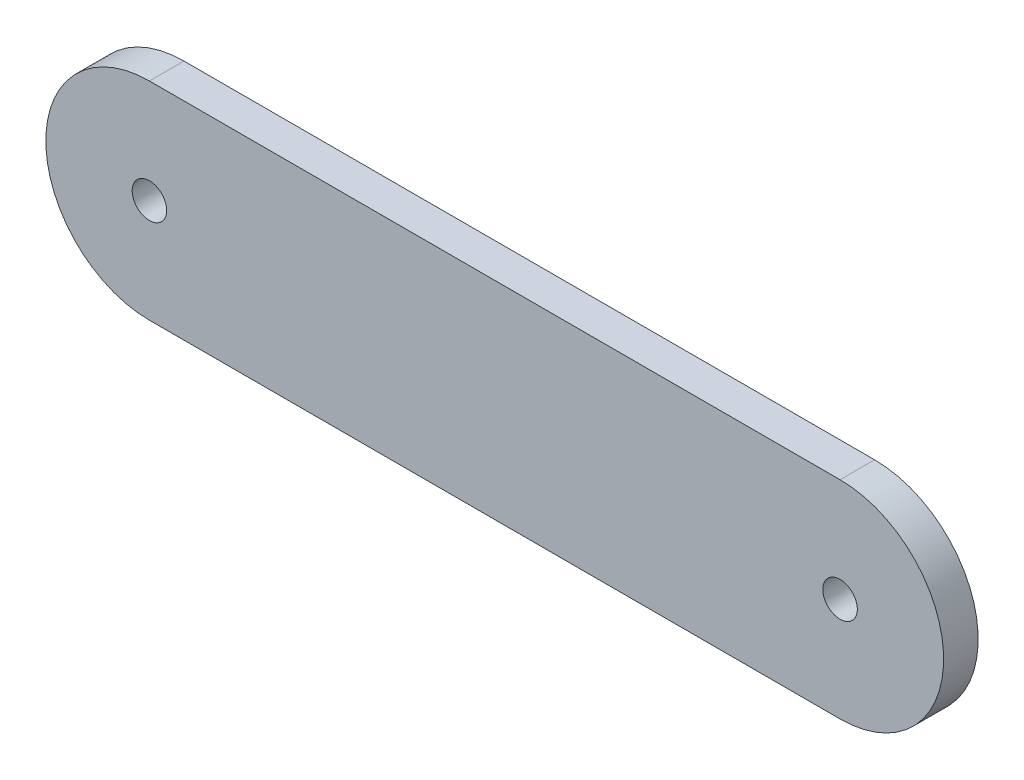
ISO-10303-21;
HEADER;
FILE_DESCRIPTION(('STEP AP214'),'2;1');
FILE_NAME('part.step','',(''),(''),'','','');
FILE_SCHEMA(('AUTOMOTIVE_DESIGN { 1 0 10303 214 1 1 1 1 }'));
ENDSEC;
DATA;
#1=APPLICATION_CONTEXT('core data for automotive mechanical design processes');
#2=APPLICATION_PROTOCOL_DEFINITION('international standard','automotive_design',2000,#1);
#3=PRODUCT_CONTEXT('',#1,'mechanical');
#4=PRODUCT('Part','Part','',(#3));
#5=PRODUCT_RELATED_PRODUCT_CATEGORY('part','',(#4));
#6=PRODUCT_DEFINITION_FORMATION('','',#4);
#7=PRODUCT_DEFINITION_CONTEXT('part definition',#1,'design');
#8=PRODUCT_DEFINITION('design','',#6,#7);
#9=PRODUCT_DEFINITION_SHAPE('','',#8);
#10=(LENGTH_UNIT() NAMED_UNIT(*) SI_UNIT(.MILLI.,.METRE.));
#11=(NAMED_UNIT(*) PLANE_ANGLE_UNIT() SI_UNIT($,.RADIAN.));
#12=(NAMED_UNIT(*) SI_UNIT($,.STERADIAN.) SOLID_ANGLE_UNIT());
#13=UNCERTAINTY_MEASURE_WITH_UNIT(LENGTH_MEASURE(1.E-05),#10,'distance_accuracy_value','');
#14=(GEOMETRIC_REPRESENTATION_CONTEXT(3) GLOBAL_UNCERTAINTY_ASSIGNED_CONTEXT((#13)) GLOBAL_UNIT_ASSIGNED_CONTEXT((#10,
#11,#12)) REPRESENTATION_CONTEXT('',''));
#15=CARTESIAN_POINT('',(0.,0.,0.));
#16=DIRECTION('',(0.,0.,1.));
#17=DIRECTION('',(1.,0.,0.));
#18=AXIS2_PLACEMENT_3D('',#15,#16,#17);
#19=CARTESIAN_POINT('',(0.,0.,5.));
#20=DIRECTION('',(0.,0.,-1.));
#21=DIRECTION('',(-1.,0.,0.));
#22=AXIS2_PLACEMENT_3D('',#19,#20,#21);
#23=CYLINDRICAL_SURFACE('',#22,15.);
#24=CARTESIAN_POINT('',(0.,0.,0.));
#25=DIRECTION('',(0.,0.,1.));
#26=DIRECTION('',(1.,0.,0.));
#27=AXIS2_PLACEMENT_3D('',#24,#25,#26);
#28=CIRCLE('',#27,15.);
#29=CARTESIAN_POINT('',(0.,15.,0.));
#30=VERTEX_POINT('',#29);
#31=CARTESIAN_POINT('',(0.,-15.,0.));
#32=VERTEX_POINT('',#31);
#33=EDGE_CURVE('E111',#30,#32,#28,.T.);
#34=ORIENTED_EDGE('',*,*,#33,.T.);
#35=DIRECTION('',(0.,0.,-1.));
#36=VECTOR('',#35,1.);
#37=CARTESIAN_POINT('',(0.,-15.,5.));
#38=LINE('',#37,#36);
#39=CARTESIAN_POINT('',(0.,-15.,5.));
#40=VERTEX_POINT('',#39);
#41=EDGE_CURVE('E11',#40,#32,#38,.T.);
#42=ORIENTED_EDGE('',*,*,#41,.F.);
#43=CARTESIAN_POINT('',(0.,0.,5.));
#44=DIRECTION('',(0.,0.,1.));
#45=DIRECTION('',(1.,0.,0.));
#46=AXIS2_PLACEMENT_3D('',#43,#44,#45);
#47=CIRCLE('',#46,15.);
#48=CARTESIAN_POINT('',(0.,15.,5.));
#49=VERTEX_POINT('',#48);
#50=EDGE_CURVE('E95',#49,#40,#47,.T.);
#51=ORIENTED_EDGE('',*,*,#50,.F.);
#52=DIRECTION('',(0.,0.,-1.));
#53=VECTOR('',#52,1.);
#54=CARTESIAN_POINT('',(0.,15.,5.));
#55=LINE('',#54,#53);
#56=EDGE_CURVE('E107',#49,#30,#55,.T.);
#57=ORIENTED_EDGE('',*,*,#56,.T.);
#58=EDGE_LOOP('',(#34,#42,#51,#57));
#59=FACE_BOUND('',#58,.T.);
#60=ADVANCED_FACE('F43',(#59),#23,.T.);
#61=CARTESIAN_POINT('',(0.,-15.,5.));
#62=DIRECTION('',(0.,1.,0.));
#63=DIRECTION('',(0.,0.,1.));
#64=AXIS2_PLACEMENT_3D('',#61,#62,#63);
#65=PLANE('',#64);
#66=DIRECTION('',(1.,0.,0.));
#67=VECTOR('',#66,1.);
#68=CARTESIAN_POINT('',(0.,-15.,0.));
#69=LINE('',#68,#67);
#70=CARTESIAN_POINT('',(100.,-15.,0.));
#71=VERTEX_POINT('',#70);
#72=EDGE_CURVE('E100',#32,#71,#69,.T.);
#73=ORIENTED_EDGE('',*,*,#72,.T.);
#74=DIRECTION('',(0.,0.,-1.));
#75=VECTOR('',#74,1.);
#76=CARTESIAN_POINT('',(100.,-15.,5.));
#77=LINE('',#76,#75);
#78=CARTESIAN_POINT('',(100.,-15.,5.));
#79=VERTEX_POINT('',#78);
#80=EDGE_CURVE('E52',#79,#71,#77,.T.);
#81=ORIENTED_EDGE('',*,*,#80,.F.);
#82=DIRECTION('',(1.,0.,0.));
#83=VECTOR('',#82,1.);
#84=CARTESIAN_POINT('',(0.,-15.,5.));
#85=LINE('',#84,#83);
#86=EDGE_CURVE('E90',#40,#79,#85,.T.);
#87=ORIENTED_EDGE('',*,*,#86,.F.);
#88=ORIENTED_EDGE('',*,*,#41,.T.);
#89=EDGE_LOOP('',(#73,#81,#87,#88));
#90=FACE_BOUND('',#89,.T.);
#91=ADVANCED_FACE('F99',(#90),#65,.F.);
#92=CARTESIAN_POINT('',(100.,0.,5.));
#93=DIRECTION('',(0.,0.,-1.));
#94=DIRECTION('',(-1.,0.,0.));
#95=AXIS2_PLACEMENT_3D('',#92,#93,#94);
#96=CYLINDRICAL_SURFACE('',#95,15.);
#97=CARTESIAN_POINT('',(100.,0.,0.));
#98=DIRECTION('',(0.,0.,1.));
#99=DIRECTION('',(1.,0.,0.));
#100=AXIS2_PLACEMENT_3D('',#97,#98,#99);
#101=CIRCLE('',#100,15.);
#102=CARTESIAN_POINT('',(100.,15.,0.));
#103=VERTEX_POINT('',#102);
#104=EDGE_CURVE('E77',#71,#103,#101,.T.);
#105=ORIENTED_EDGE('',*,*,#104,.T.);
#106=DIRECTION('',(0.,0.,-1.));
#107=VECTOR('',#106,1.);
#108=CARTESIAN_POINT('',(100.,15.,5.));
#109=LINE('',#108,#107);
#110=CARTESIAN_POINT('',(100.,15.,5.));
#111=VERTEX_POINT('',#110);
#112=EDGE_CURVE('E102',#111,#103,#109,.T.);
#113=ORIENTED_EDGE('',*,*,#112,.F.);
#114=CARTESIAN_POINT('',(100.,0.,5.));
#115=DIRECTION('',(0.,0.,1.));
#116=DIRECTION('',(1.,0.,0.));
#117=AXIS2_PLACEMENT_3D('',#114,#115,#116);
#118=CIRCLE('',#117,15.);
#119=EDGE_CURVE('E93',#79,#111,#118,.T.);
#120=ORIENTED_EDGE('',*,*,#119,.F.);
#121=ORIENTED_EDGE('',*,*,#80,.T.);
#122=EDGE_LOOP('',(#105,#113,#120,#121));
#123=FACE_BOUND('',#122,.T.);
#124=ADVANCED_FACE('F103',(#123),#96,.T.);
#125=CARTESIAN_POINT('',(0.,15.,5.));
#126=DIRECTION('',(0.,-1.,0.));
#127=DIRECTION('',(0.,0.,-1.));
#128=AXIS2_PLACEMENT_3D('',#125,#126,#127);
#129=PLANE('',#128);
#130=DIRECTION('',(-1.,0.,0.));
#131=VECTOR('',#130,1.);
#132=CARTESIAN_POINT('',(0.,15.,0.));
#133=LINE('',#132,#131);
#134=EDGE_CURVE('E83',#103,#30,#133,.T.);
#135=ORIENTED_EDGE('',*,*,#134,.T.);
#136=ORIENTED_EDGE('',*,*,#56,.F.);
#137=DIRECTION('',(-1.,0.,0.));
#138=VECTOR('',#137,1.);
#139=CARTESIAN_POINT('',(0.,15.,5.));
#140=LINE('',#139,#138);
#141=EDGE_CURVE('E60',#111,#49,#140,.T.);
#142=ORIENTED_EDGE('',*,*,#141,.F.);
#143=ORIENTED_EDGE('',*,*,#112,.T.);
#144=EDGE_LOOP('',(#135,#136,#142,#143));
#145=FACE_BOUND('',#144,.T.);
#146=ADVANCED_FACE('F125',(#145),#129,.F.);
#147=CARTESIAN_POINT('',(0.,0.,5.));
#148=DIRECTION('',(0.,0.,1.));
#149=DIRECTION('',(1.,0.,0.));
#150=AXIS2_PLACEMENT_3D('',#147,#148,#149);
#151=PLANE('',#150);
#152=CARTESIAN_POINT('',(0.,0.,5.));
#153=DIRECTION('',(0.,0.,-1.));
#154=DIRECTION('',(-1.,0.,0.));
#155=AXIS2_PLACEMENT_3D('',#152,#153,#154);
#156=CIRCLE('',#155,2.5);
#157=CARTESIAN_POINT('',(-2.5,0.,5.));
#158=VERTEX_POINT('',#157);
#159=EDGE_CURVE('E115',#158,#158,#156,.T.);
#160=ORIENTED_EDGE('',*,*,#159,.T.);
#161=EDGE_LOOP('',(#160));
#162=FACE_BOUND('',#161,.T.);
#163=CARTESIAN_POINT('',(100.,0.,5.));
#164=DIRECTION('',(0.,0.,-1.));
#165=DIRECTION('',(-1.,0.,0.));
#166=AXIS2_PLACEMENT_3D('',#163,#164,#165);
#167=CIRCLE('',#166,2.5);
#168=CARTESIAN_POINT('',(97.5,0.,5.));
#169=VERTEX_POINT('',#168);
#170=EDGE_CURVE('E132',#169,#169,#167,.T.);
#171=ORIENTED_EDGE('',*,*,#170,.T.);
#172=EDGE_LOOP('',(#171));
#173=FACE_BOUND('',#172,.T.);
#174=ORIENTED_EDGE('',*,*,#50,.T.);
#175=ORIENTED_EDGE('',*,*,#86,.T.);
#176=ORIENTED_EDGE('',*,*,#119,.T.);
#177=ORIENTED_EDGE('',*,*,#141,.T.);
#178=EDGE_LOOP('',(#174,#175,#176,#177));
#179=FACE_BOUND('',#178,.T.);
#180=ADVANCED_FACE('F91',(#162,#173,#179),#151,.T.);
#181=CARTESIAN_POINT('',(0.,0.,0.));
#182=DIRECTION('',(0.,0.,1.));
#183=DIRECTION('',(1.,0.,0.));
#184=AXIS2_PLACEMENT_3D('',#181,#182,#183);
#185=PLANE('',#184);
#186=CARTESIAN_POINT('',(0.,0.,0.));
#187=DIRECTION('',(0.,0.,-1.));
#188=DIRECTION('',(-1.,0.,0.));
#189=AXIS2_PLACEMENT_3D('',#186,#187,#188);
#190=CIRCLE('',#189,2.5);
#191=CARTESIAN_POINT('',(-2.5,0.,0.));
#192=VERTEX_POINT('',#191);
#193=EDGE_CURVE('E140',#192,#192,#190,.T.);
#194=ORIENTED_EDGE('',*,*,#193,.F.);
#195=EDGE_LOOP('',(#194));
#196=FACE_BOUND('',#195,.T.);
#197=CARTESIAN_POINT('',(100.,0.,0.));
#198=DIRECTION('',(0.,0.,-1.));
#199=DIRECTION('',(-1.,0.,0.));
#200=AXIS2_PLACEMENT_3D('',#197,#198,#199);
#201=CIRCLE('',#200,2.5);
#202=CARTESIAN_POINT('',(97.5,0.,0.));
#203=VERTEX_POINT('',#202);
#204=EDGE_CURVE('E136',#203,#203,#201,.T.);
#205=ORIENTED_EDGE('',*,*,#204,.F.);
#206=EDGE_LOOP('',(#205));
#207=FACE_BOUND('',#206,.T.);
#208=ORIENTED_EDGE('',*,*,#33,.F.);
#209=ORIENTED_EDGE('',*,*,#134,.F.);
#210=ORIENTED_EDGE('',*,*,#104,.F.);
#211=ORIENTED_EDGE('',*,*,#72,.F.);
#212=EDGE_LOOP('',(#208,#209,#210,#211));
#213=FACE_BOUND('',#212,.T.);
#214=ADVANCED_FACE('F128',(#196,#207,#213),#185,.F.);
#215=CARTESIAN_POINT('',(100.,0.,5.));
#216=DIRECTION('',(0.,0.,-1.));
#217=DIRECTION('',(-1.,0.,0.));
#218=AXIS2_PLACEMENT_3D('',#215,#216,#217);
#219=CYLINDRICAL_SURFACE('',#218,2.5);
#220=ORIENTED_EDGE('',*,*,#170,.F.);
#221=EDGE_LOOP('',(#220));
#222=FACE_BOUND('',#221,.T.);
#223=ORIENTED_EDGE('',*,*,#204,.T.);
#224=EDGE_LOOP('',(#223));
#225=FACE_BOUND('',#224,.T.);
#226=ADVANCED_FACE('F153',(#222,#225),#219,.F.);
#227=CARTESIAN_POINT('',(0.,0.,5.));
#228=DIRECTION('',(0.,0.,-1.));
#229=DIRECTION('',(-1.,0.,0.));
#230=AXIS2_PLACEMENT_3D('',#227,#228,#229);
#231=CYLINDRICAL_SURFACE('',#230,2.5);
#232=ORIENTED_EDGE('',*,*,#159,.F.);
#233=EDGE_LOOP('',(#232));
#234=FACE_BOUND('',#233,.T.);
#235=ORIENTED_EDGE('',*,*,#193,.T.);
#236=EDGE_LOOP('',(#235));
#237=FACE_BOUND('',#236,.T.);
#238=ADVANCED_FACE('F150',(#234,#237),#231,.F.);
#239=CLOSED_SHELL('',(#60,#91,#124,#146,#180,#214,#226,#238));
#240=MANIFOLD_SOLID_BREP('B2',#239);
#241=ADVANCED_BREP_SHAPE_REPRESENTATION('',(#18,#240),#14);
#242=SHAPE_DEFINITION_REPRESENTATION(#9,#241);
ENDSEC;
END-ISO-10303-21;
